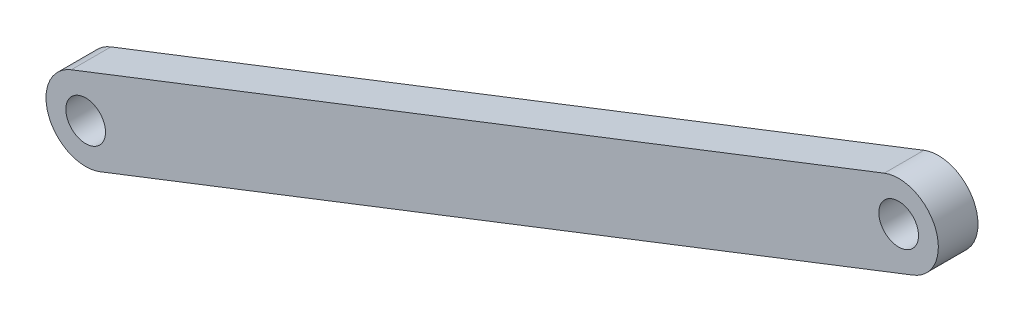
ISO-10303-21;
HEADER;
FILE_DESCRIPTION(('STEP AP214'),'2;1');
FILE_NAME('part.step','',(''),(''),'','','');
FILE_SCHEMA(('AUTOMOTIVE_DESIGN { 1 0 10303 214 1 1 1 1 }'));
ENDSEC;
DATA;
#1=APPLICATION_CONTEXT('core data for automotive mechanical design processes');
#2=APPLICATION_PROTOCOL_DEFINITION('international standard','automotive_design',2000,#1);
#3=PRODUCT_CONTEXT('',#1,'mechanical');
#4=PRODUCT('Part','Part','',(#3));
#5=PRODUCT_RELATED_PRODUCT_CATEGORY('part','',(#4));
#6=PRODUCT_DEFINITION_FORMATION('','',#4);
#7=PRODUCT_DEFINITION_CONTEXT('part definition',#1,'design');
#8=PRODUCT_DEFINITION('design','',#6,#7);
#9=PRODUCT_DEFINITION_SHAPE('','',#8);
#10=(LENGTH_UNIT() NAMED_UNIT(*) SI_UNIT(.MILLI.,.METRE.));
#11=(NAMED_UNIT(*) PLANE_ANGLE_UNIT() SI_UNIT($,.RADIAN.));
#12=(NAMED_UNIT(*) SI_UNIT($,.STERADIAN.) SOLID_ANGLE_UNIT());
#13=UNCERTAINTY_MEASURE_WITH_UNIT(LENGTH_MEASURE(1.E-05),#10,'distance_accuracy_value','');
#14=(GEOMETRIC_REPRESENTATION_CONTEXT(3) GLOBAL_UNCERTAINTY_ASSIGNED_CONTEXT((#13)) GLOBAL_UNIT_ASSIGNED_CONTEXT((#10,
#11,#12)) REPRESENTATION_CONTEXT('',''));
#15=CARTESIAN_POINT('',(0.,0.,0.));
#16=DIRECTION('',(0.,0.,1.));
#17=DIRECTION('',(1.,0.,0.));
#18=AXIS2_PLACEMENT_3D('',#15,#16,#17);
#19=CARTESIAN_POINT('',(0.,30.,0.));
#20=DIRECTION('',(0.,0.,-1.));
#21=DIRECTION('',(-1.,0.,0.));
#22=AXIS2_PLACEMENT_3D('',#19,#20,#21);
#23=PLANE('',#22);
#24=CARTESIAN_POINT('',(0.,30.,0.));
#25=DIRECTION('',(0.,0.,-1.));
#26=DIRECTION('',(-1.,0.,0.));
#27=AXIS2_PLACEMENT_3D('',#24,#25,#26);
#28=CIRCLE('',#27,2.5);
#29=CARTESIAN_POINT('',(-2.5,30.,0.));
#30=VERTEX_POINT('',#29);
#31=EDGE_CURVE('E106',#30,#30,#28,.T.);
#32=ORIENTED_EDGE('',*,*,#31,.F.);
#33=EDGE_LOOP('',(#32));
#34=FACE_BOUND('',#33,.T.);
#35=CARTESIAN_POINT('',(0.,30.,0.));
#36=DIRECTION('',(0.,0.,-1.));
#37=DIRECTION('',(-1.,0.,0.));
#38=AXIS2_PLACEMENT_3D('',#35,#36,#37);
#39=CIRCLE('',#38,5.);
#40=CARTESIAN_POINT('',(1.81617342499557,25.341511608865,0.));
#41=VERTEX_POINT('',#40);
#42=CARTESIAN_POINT('',(-1.81617342499557,34.658488391135,0.));
#43=VERTEX_POINT('',#42);
#44=EDGE_CURVE('E91',#41,#43,#39,.T.);
#45=ORIENTED_EDGE('',*,*,#44,.T.);
#46=DIRECTION('',(0.931697678227007,0.363234684999113,0.));
#47=VECTOR('',#46,1.);
#48=CARTESIAN_POINT('',(-1.81617342499557,34.658488391135,0.));
#49=LINE('',#48,#47);
#50=CARTESIAN_POINT('',(100.670571179975,74.6143037410375,0.));
#51=VERTEX_POINT('',#50);
#52=EDGE_CURVE('E86',#43,#51,#49,.T.);
#53=ORIENTED_EDGE('',*,*,#52,.T.);
#54=CARTESIAN_POINT('',(102.486744604971,69.9558153499025,0.));
#55=DIRECTION('',(0.,0.,-1.));
#56=DIRECTION('',(-1.,0.,0.));
#57=AXIS2_PLACEMENT_3D('',#54,#55,#56);
#58=CIRCLE('',#57,5.00000000000001);
#59=CARTESIAN_POINT('',(104.302918029966,65.2973269587674,0.));
#60=VERTEX_POINT('',#59);
#61=EDGE_CURVE('E89',#51,#60,#58,.T.);
#62=ORIENTED_EDGE('',*,*,#61,.T.);
#63=DIRECTION('',(-0.931697678227007,-0.363234684999113,0.));
#64=VECTOR('',#63,1.);
#65=CARTESIAN_POINT('',(1.81617342499557,25.341511608865,0.));
#66=LINE('',#65,#64);
#67=EDGE_CURVE('E56',#60,#41,#66,.T.);
#68=ORIENTED_EDGE('',*,*,#67,.T.);
#69=EDGE_LOOP('',(#45,#53,#62,#68));
#70=FACE_BOUND('',#69,.T.);
#71=CARTESIAN_POINT('',(102.486744604971,69.9558153499025,0.));
#72=DIRECTION('',(0.,0.,-1.));
#73=DIRECTION('',(-1.,0.,0.));
#74=AXIS2_PLACEMENT_3D('',#71,#72,#73);
#75=CIRCLE('',#74,2.50000000000001);
#76=CARTESIAN_POINT('',(99.9867446049707,69.9558153499025,0.));
#77=VERTEX_POINT('',#76);
#78=EDGE_CURVE('E121',#77,#77,#75,.T.);
#79=ORIENTED_EDGE('',*,*,#78,.F.);
#80=EDGE_LOOP('',(#79));
#81=FACE_BOUND('',#80,.T.);
#82=ADVANCED_FACE('F39',(#34,#70,#81),#23,.T.);
#83=CARTESIAN_POINT('',(-1.81617342499557,34.658488391135,0.));
#84=DIRECTION('',(0.363234684999113,-0.931697678227007,0.));
#85=DIRECTION('',(0.931697678227007,0.363234684999113,0.));
#86=AXIS2_PLACEMENT_3D('',#83,#84,#85);
#87=PLANE('',#86);
#88=DIRECTION('',(0.931697678227007,0.363234684999113,0.));
#89=VECTOR('',#88,1.);
#90=CARTESIAN_POINT('',(-1.81617342499557,34.658488391135,5.));
#91=LINE('',#90,#89);
#92=CARTESIAN_POINT('',(-1.81617342499557,34.658488391135,5.));
#93=VERTEX_POINT('',#92);
#94=CARTESIAN_POINT('',(100.670571179975,74.6143037410375,5.));
#95=VERTEX_POINT('',#94);
#96=EDGE_CURVE('E95',#93,#95,#91,.T.);
#97=ORIENTED_EDGE('',*,*,#96,.T.);
#98=DIRECTION('',(0.,0.,1.));
#99=VECTOR('',#98,1.);
#100=CARTESIAN_POINT('',(100.670571179975,74.6143037410375,0.));
#101=LINE('',#100,#99);
#102=EDGE_CURVE('E48',#51,#95,#101,.T.);
#103=ORIENTED_EDGE('',*,*,#102,.F.);
#104=ORIENTED_EDGE('',*,*,#52,.F.);
#105=DIRECTION('',(0.,0.,1.));
#106=VECTOR('',#105,1.);
#107=CARTESIAN_POINT('',(-1.81617342499557,34.658488391135,0.));
#108=LINE('',#107,#106);
#109=EDGE_CURVE('E11',#43,#93,#108,.T.);
#110=ORIENTED_EDGE('',*,*,#109,.T.);
#111=EDGE_LOOP('',(#97,#103,#104,#110));
#112=FACE_BOUND('',#111,.T.);
#113=ADVANCED_FACE('F94',(#112),#87,.F.);
#114=CARTESIAN_POINT('',(102.486744604971,69.9558153499025,0.));
#115=DIRECTION('',(0.,0.,1.));
#116=DIRECTION('',(1.,0.,0.));
#117=AXIS2_PLACEMENT_3D('',#114,#115,#116);
#118=CYLINDRICAL_SURFACE('',#117,5.00000000000001);
#119=CARTESIAN_POINT('',(102.486744604971,69.9558153499025,5.));
#120=DIRECTION('',(0.,0.,-1.));
#121=DIRECTION('',(-1.,0.,0.));
#122=AXIS2_PLACEMENT_3D('',#119,#120,#121);
#123=CIRCLE('',#122,5.00000000000001);
#124=CARTESIAN_POINT('',(104.302918029966,65.2973269587674,5.));
#125=VERTEX_POINT('',#124);
#126=EDGE_CURVE('E73',#95,#125,#123,.T.);
#127=ORIENTED_EDGE('',*,*,#126,.T.);
#128=DIRECTION('',(0.,0.,1.));
#129=VECTOR('',#128,1.);
#130=CARTESIAN_POINT('',(104.302918029966,65.2973269587674,0.));
#131=LINE('',#130,#129);
#132=EDGE_CURVE('E96',#60,#125,#131,.T.);
#133=ORIENTED_EDGE('',*,*,#132,.F.);
#134=ORIENTED_EDGE('',*,*,#61,.F.);
#135=ORIENTED_EDGE('',*,*,#102,.T.);
#136=EDGE_LOOP('',(#127,#133,#134,#135));
#137=FACE_BOUND('',#136,.T.);
#138=ADVANCED_FACE('F97',(#137),#118,.T.);
#139=CARTESIAN_POINT('',(0.,30.,0.));
#140=DIRECTION('',(0.,0.,1.));
#141=DIRECTION('',(1.,0.,0.));
#142=AXIS2_PLACEMENT_3D('',#139,#140,#141);
#143=CYLINDRICAL_SURFACE('',#142,5.);
#144=CARTESIAN_POINT('',(0.,30.,5.));
#145=DIRECTION('',(0.,0.,-1.));
#146=DIRECTION('',(-1.,0.,0.));
#147=AXIS2_PLACEMENT_3D('',#144,#145,#146);
#148=CIRCLE('',#147,5.);
#149=CARTESIAN_POINT('',(1.81617342499557,25.341511608865,5.));
#150=VERTEX_POINT('',#149);
#151=EDGE_CURVE('E103',#150,#93,#148,.T.);
#152=ORIENTED_EDGE('',*,*,#151,.T.);
#153=ORIENTED_EDGE('',*,*,#109,.F.);
#154=ORIENTED_EDGE('',*,*,#44,.F.);
#155=DIRECTION('',(0.,0.,1.));
#156=VECTOR('',#155,1.);
#157=CARTESIAN_POINT('',(1.81617342499557,25.341511608865,0.));
#158=LINE('',#157,#156);
#159=EDGE_CURVE('E99',#41,#150,#158,.T.);
#160=ORIENTED_EDGE('',*,*,#159,.T.);
#161=EDGE_LOOP('',(#152,#153,#154,#160));
#162=FACE_BOUND('',#161,.T.);
#163=ADVANCED_FACE('F41',(#162),#143,.T.);
#164=CARTESIAN_POINT('',(0.,30.,5.));
#165=DIRECTION('',(0.,0.,-1.));
#166=DIRECTION('',(-1.,0.,0.));
#167=AXIS2_PLACEMENT_3D('',#164,#165,#166);
#168=PLANE('',#167);
#169=ORIENTED_EDGE('',*,*,#151,.F.);
#170=DIRECTION('',(-0.931697678227007,-0.363234684999113,0.));
#171=VECTOR('',#170,1.);
#172=CARTESIAN_POINT('',(1.81617342499557,25.341511608865,5.));
#173=LINE('',#172,#171);
#174=EDGE_CURVE('E79',#125,#150,#173,.T.);
#175=ORIENTED_EDGE('',*,*,#174,.F.);
#176=ORIENTED_EDGE('',*,*,#126,.F.);
#177=ORIENTED_EDGE('',*,*,#96,.F.);
#178=EDGE_LOOP('',(#169,#175,#176,#177));
#179=FACE_BOUND('',#178,.T.);
#180=CARTESIAN_POINT('',(0.,30.,5.));
#181=DIRECTION('',(0.,0.,-1.));
#182=DIRECTION('',(-1.,0.,0.));
#183=AXIS2_PLACEMENT_3D('',#180,#181,#182);
#184=CIRCLE('',#183,2.5);
#185=CARTESIAN_POINT('',(-2.5,30.,5.));
#186=VERTEX_POINT('',#185);
#187=EDGE_CURVE('E118',#186,#186,#184,.T.);
#188=ORIENTED_EDGE('',*,*,#187,.T.);
#189=EDGE_LOOP('',(#188));
#190=FACE_BOUND('',#189,.T.);
#191=CARTESIAN_POINT('',(102.486744604971,69.9558153499025,5.));
#192=DIRECTION('',(0.,0.,-1.));
#193=DIRECTION('',(-1.,0.,0.));
#194=AXIS2_PLACEMENT_3D('',#191,#192,#193);
#195=CIRCLE('',#194,2.50000000000001);
#196=CARTESIAN_POINT('',(99.9867446049707,69.9558153499025,5.));
#197=VERTEX_POINT('',#196);
#198=EDGE_CURVE('E124',#197,#197,#195,.T.);
#199=ORIENTED_EDGE('',*,*,#198,.T.);
#200=EDGE_LOOP('',(#199));
#201=FACE_BOUND('',#200,.T.);
#202=ADVANCED_FACE('F114',(#179,#190,#201),#168,.F.);
#203=CARTESIAN_POINT('',(102.486744604971,69.9558153499025,0.));
#204=DIRECTION('',(0.,0.,1.));
#205=DIRECTION('',(1.,0.,0.));
#206=AXIS2_PLACEMENT_3D('',#203,#204,#205);
#207=CYLINDRICAL_SURFACE('',#206,2.50000000000001);
#208=ORIENTED_EDGE('',*,*,#78,.T.);
#209=EDGE_LOOP('',(#208));
#210=FACE_BOUND('',#209,.T.);
#211=ORIENTED_EDGE('',*,*,#198,.F.);
#212=EDGE_LOOP('',(#211));
#213=FACE_BOUND('',#212,.T.);
#214=ADVANCED_FACE('F130',(#210,#213),#207,.F.);
#215=CARTESIAN_POINT('',(0.,30.,0.));
#216=DIRECTION('',(0.,0.,1.));
#217=DIRECTION('',(1.,0.,0.));
#218=AXIS2_PLACEMENT_3D('',#215,#216,#217);
#219=CYLINDRICAL_SURFACE('',#218,2.5);
#220=ORIENTED_EDGE('',*,*,#31,.T.);
#221=EDGE_LOOP('',(#220));
#222=FACE_BOUND('',#221,.T.);
#223=ORIENTED_EDGE('',*,*,#187,.F.);
#224=EDGE_LOOP('',(#223));
#225=FACE_BOUND('',#224,.T.);
#226=ADVANCED_FACE('F142',(#222,#225),#219,.F.);
#227=CARTESIAN_POINT('',(1.81617342499557,25.341511608865,0.));
#228=DIRECTION('',(-0.363234684999113,0.931697678227007,0.));
#229=DIRECTION('',(-0.931697678227007,-0.363234684999113,0.));
#230=AXIS2_PLACEMENT_3D('',#227,#228,#229);
#231=PLANE('',#230);
#232=ORIENTED_EDGE('',*,*,#174,.T.);
#233=ORIENTED_EDGE('',*,*,#159,.F.);
#234=ORIENTED_EDGE('',*,*,#67,.F.);
#235=ORIENTED_EDGE('',*,*,#132,.T.);
#236=EDGE_LOOP('',(#232,#233,#234,#235));
#237=FACE_BOUND('',#236,.T.);
#238=ADVANCED_FACE('F111',(#237),#231,.F.);
#239=CLOSED_SHELL('',(#82,#113,#138,#163,#202,#214,#226,#238));
#240=MANIFOLD_SOLID_BREP('B2',#239);
#241=ADVANCED_BREP_SHAPE_REPRESENTATION('',(#18,#240),#14);
#242=SHAPE_DEFINITION_REPRESENTATION(#9,#241);
ENDSEC;
END-ISO-10303-21;
